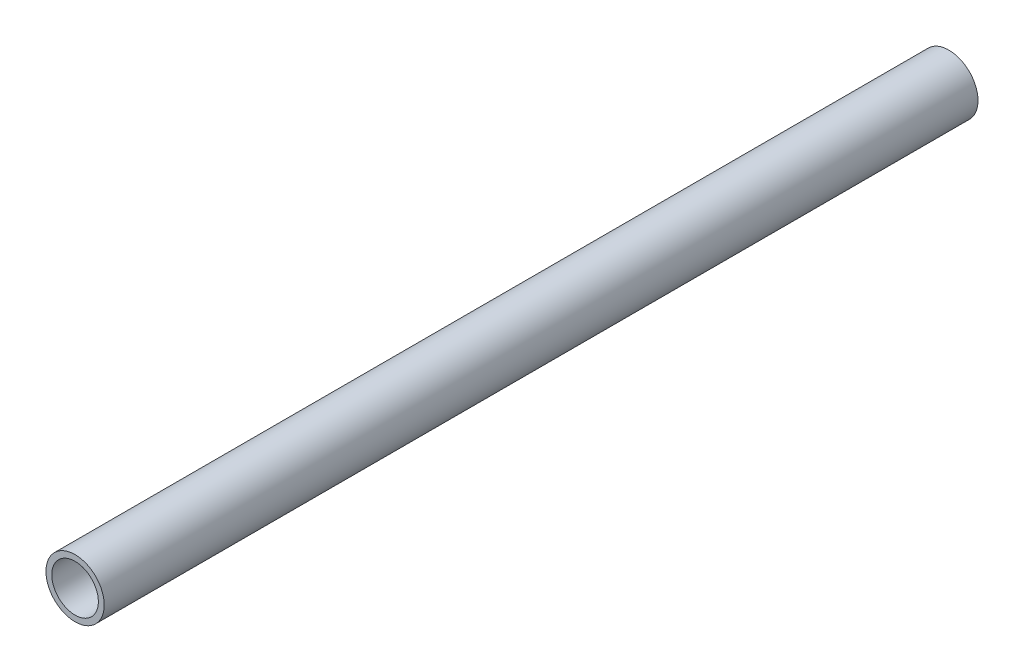
ISO-10303-21;
HEADER;
FILE_DESCRIPTION(('STEP AP214'),'2;1');
FILE_NAME('part.step','',(''),(''),'','','');
FILE_SCHEMA(('AUTOMOTIVE_DESIGN { 1 0 10303 214 1 1 1 1 }'));
ENDSEC;
DATA;
#1=APPLICATION_CONTEXT('core data for automotive mechanical design processes');
#2=APPLICATION_PROTOCOL_DEFINITION('international standard','automotive_design',2000,#1);
#3=PRODUCT_CONTEXT('',#1,'mechanical');
#4=PRODUCT('Part','Part','',(#3));
#5=PRODUCT_RELATED_PRODUCT_CATEGORY('part','',(#4));
#6=PRODUCT_DEFINITION_FORMATION('','',#4);
#7=PRODUCT_DEFINITION_CONTEXT('part definition',#1,'design');
#8=PRODUCT_DEFINITION('design','',#6,#7);
#9=PRODUCT_DEFINITION_SHAPE('','',#8);
#10=(LENGTH_UNIT() NAMED_UNIT(*) SI_UNIT(.MILLI.,.METRE.));
#11=(NAMED_UNIT(*) PLANE_ANGLE_UNIT() SI_UNIT($,.RADIAN.));
#12=(NAMED_UNIT(*) SI_UNIT($,.STERADIAN.) SOLID_ANGLE_UNIT());
#13=UNCERTAINTY_MEASURE_WITH_UNIT(LENGTH_MEASURE(1.E-05),#10,'distance_accuracy_value','');
#14=(GEOMETRIC_REPRESENTATION_CONTEXT(3) GLOBAL_UNCERTAINTY_ASSIGNED_CONTEXT((#13)) GLOBAL_UNIT_ASSIGNED_CONTEXT((#10,
#11,#12)) REPRESENTATION_CONTEXT('',''));
#15=CARTESIAN_POINT('',(0.,0.,0.));
#16=DIRECTION('',(0.,0.,1.));
#17=DIRECTION('',(1.,0.,0.));
#18=AXIS2_PLACEMENT_3D('',#15,#16,#17);
#19=CARTESIAN_POINT('',(0.,0.,300.));
#20=DIRECTION('',(0.,0.,1.));
#21=DIRECTION('',(1.,0.,0.));
#22=AXIS2_PLACEMENT_3D('',#19,#20,#21);
#23=PLANE('',#22);
#24=CARTESIAN_POINT('',(0.,0.,300.));
#25=DIRECTION('',(0.,0.,1.));
#26=DIRECTION('',(1.,0.,0.));
#27=AXIS2_PLACEMENT_3D('',#24,#25,#26);
#28=CIRCLE('',#27,10.);
#29=CARTESIAN_POINT('',(10.,0.,300.));
#30=VERTEX_POINT('',#29);
#31=EDGE_CURVE('E10',#30,#30,#28,.T.);
#32=ORIENTED_EDGE('',*,*,#31,.T.);
#33=EDGE_LOOP('',(#32));
#34=FACE_BOUND('',#33,.T.);
#35=CARTESIAN_POINT('',(0.,0.,300.));
#36=DIRECTION('',(0.,0.,1.));
#37=DIRECTION('',(1.,0.,0.));
#38=AXIS2_PLACEMENT_3D('',#35,#36,#37);
#39=CIRCLE('',#38,8.);
#40=CARTESIAN_POINT('',(8.,0.,300.));
#41=VERTEX_POINT('',#40);
#42=EDGE_CURVE('E50',#41,#41,#39,.T.);
#43=ORIENTED_EDGE('',*,*,#42,.F.);
#44=EDGE_LOOP('',(#43));
#45=FACE_BOUND('',#44,.T.);
#46=ADVANCED_FACE('F39',(#34,#45),#23,.T.);
#47=CARTESIAN_POINT('',(0.,0.,0.));
#48=DIRECTION('',(0.,0.,1.));
#49=DIRECTION('',(1.,0.,0.));
#50=AXIS2_PLACEMENT_3D('',#47,#48,#49);
#51=PLANE('',#50);
#52=CARTESIAN_POINT('',(0.,0.,0.));
#53=DIRECTION('',(0.,0.,1.));
#54=DIRECTION('',(1.,0.,0.));
#55=AXIS2_PLACEMENT_3D('',#52,#53,#54);
#56=CIRCLE('',#55,10.);
#57=CARTESIAN_POINT('',(10.,0.,0.));
#58=VERTEX_POINT('',#57);
#59=EDGE_CURVE('E43',#58,#58,#56,.T.);
#60=ORIENTED_EDGE('',*,*,#59,.F.);
#61=EDGE_LOOP('',(#60));
#62=FACE_BOUND('',#61,.T.);
#63=CARTESIAN_POINT('',(0.,0.,0.));
#64=DIRECTION('',(0.,0.,1.));
#65=DIRECTION('',(1.,0.,0.));
#66=AXIS2_PLACEMENT_3D('',#63,#64,#65);
#67=CIRCLE('',#66,8.);
#68=CARTESIAN_POINT('',(8.,0.,0.));
#69=VERTEX_POINT('',#68);
#70=EDGE_CURVE('E52',#69,#69,#67,.T.);
#71=ORIENTED_EDGE('',*,*,#70,.T.);
#72=EDGE_LOOP('',(#71));
#73=FACE_BOUND('',#72,.T.);
#74=ADVANCED_FACE('F62',(#62,#73),#51,.F.);
#75=CARTESIAN_POINT('',(0.,0.,300.));
#76=DIRECTION('',(0.,0.,-1.));
#77=DIRECTION('',(-1.,0.,0.));
#78=AXIS2_PLACEMENT_3D('',#75,#76,#77);
#79=CYLINDRICAL_SURFACE('',#78,10.);
#80=ORIENTED_EDGE('',*,*,#31,.F.);
#81=EDGE_LOOP('',(#80));
#82=FACE_BOUND('',#81,.T.);
#83=ORIENTED_EDGE('',*,*,#59,.T.);
#84=EDGE_LOOP('',(#83));
#85=FACE_BOUND('',#84,.T.);
#86=ADVANCED_FACE('F41',(#82,#85),#79,.T.);
#87=CARTESIAN_POINT('',(0.,0.,300.));
#88=DIRECTION('',(0.,0.,-1.));
#89=DIRECTION('',(-1.,0.,0.));
#90=AXIS2_PLACEMENT_3D('',#87,#88,#89);
#91=CYLINDRICAL_SURFACE('',#90,8.);
#92=ORIENTED_EDGE('',*,*,#42,.T.);
#93=EDGE_LOOP('',(#92));
#94=FACE_BOUND('',#93,.T.);
#95=ORIENTED_EDGE('',*,*,#70,.F.);
#96=EDGE_LOOP('',(#95));
#97=FACE_BOUND('',#96,.T.);
#98=ADVANCED_FACE('F58',(#94,#97),#91,.F.);
#99=CLOSED_SHELL('',(#46,#74,#86,#98));
#100=MANIFOLD_SOLID_BREP('B2',#99);
#101=ADVANCED_BREP_SHAPE_REPRESENTATION('',(#18,#100),#14);
#102=SHAPE_DEFINITION_REPRESENTATION(#9,#101);
ENDSEC;
END-ISO-10303-21;
